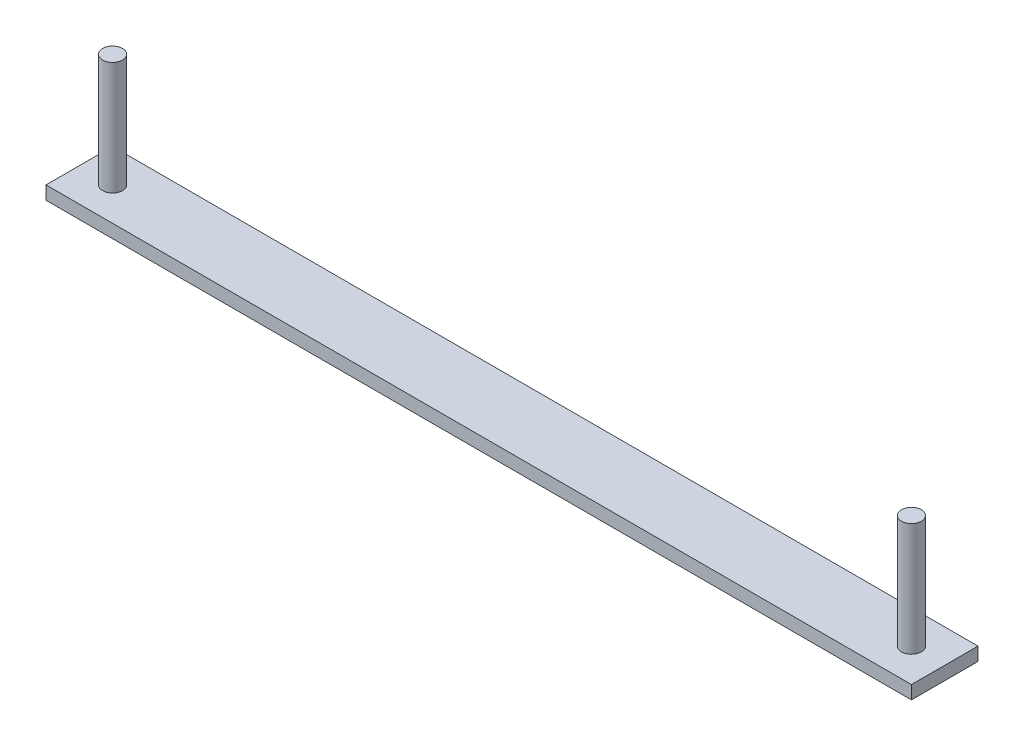
ISO-10303-21;
HEADER;
FILE_DESCRIPTION(('STEP AP214'),'2;1');
FILE_NAME('part.step','',(''),(''),'','','');
FILE_SCHEMA(('AUTOMOTIVE_DESIGN { 1 0 10303 214 1 1 1 1 }'));
ENDSEC;
DATA;
#1=APPLICATION_CONTEXT('core data for automotive mechanical design processes');
#2=APPLICATION_PROTOCOL_DEFINITION('international standard','automotive_design',2000,#1);
#3=PRODUCT_CONTEXT('',#1,'mechanical');
#4=PRODUCT('Part','Part','',(#3));
#5=PRODUCT_RELATED_PRODUCT_CATEGORY('part','',(#4));
#6=PRODUCT_DEFINITION_FORMATION('','',#4);
#7=PRODUCT_DEFINITION_CONTEXT('part definition',#1,'design');
#8=PRODUCT_DEFINITION('design','',#6,#7);
#9=PRODUCT_DEFINITION_SHAPE('','',#8);
#10=(LENGTH_UNIT() NAMED_UNIT(*) SI_UNIT(.MILLI.,.METRE.));
#11=(NAMED_UNIT(*) PLANE_ANGLE_UNIT() SI_UNIT($,.RADIAN.));
#12=(NAMED_UNIT(*) SI_UNIT($,.STERADIAN.) SOLID_ANGLE_UNIT());
#13=UNCERTAINTY_MEASURE_WITH_UNIT(LENGTH_MEASURE(1.E-05),#10,'distance_accuracy_value','');
#14=(GEOMETRIC_REPRESENTATION_CONTEXT(3) GLOBAL_UNCERTAINTY_ASSIGNED_CONTEXT((#13)) GLOBAL_UNIT_ASSIGNED_CONTEXT((#10,
#11,#12)) REPRESENTATION_CONTEXT('',''));
#15=CARTESIAN_POINT('',(0.,0.,0.));
#16=DIRECTION('',(0.,0.,1.));
#17=DIRECTION('',(1.,0.,0.));
#18=AXIS2_PLACEMENT_3D('',#15,#16,#17);
#19=CARTESIAN_POINT('',(65.,2.,5.));
#20=DIRECTION('',(-1.,0.,0.));
#21=DIRECTION('',(0.,0.,1.));
#22=AXIS2_PLACEMENT_3D('',#19,#20,#21);
#23=PLANE('',#22);
#24=DIRECTION('',(0.,0.,-1.));
#25=VECTOR('',#24,1.);
#26=CARTESIAN_POINT('',(65.,0.,5.));
#27=LINE('',#26,#25);
#28=CARTESIAN_POINT('',(65.,0.,5.));
#29=VERTEX_POINT('',#28);
#30=CARTESIAN_POINT('',(65.,0.,-5.));
#31=VERTEX_POINT('',#30);
#32=EDGE_CURVE('E116',#29,#31,#27,.T.);
#33=ORIENTED_EDGE('',*,*,#32,.T.);
#34=DIRECTION('',(0.,-1.,0.));
#35=VECTOR('',#34,1.);
#36=CARTESIAN_POINT('',(65.,2.,-5.));
#37=LINE('',#36,#35);
#38=CARTESIAN_POINT('',(65.,2.,-5.));
#39=VERTEX_POINT('',#38);
#40=EDGE_CURVE('E54',#39,#31,#37,.T.);
#41=ORIENTED_EDGE('',*,*,#40,.F.);
#42=DIRECTION('',(0.,0.,-1.));
#43=VECTOR('',#42,1.);
#44=CARTESIAN_POINT('',(65.,2.,5.));
#45=LINE('',#44,#43);
#46=CARTESIAN_POINT('',(65.,2.,5.));
#47=VERTEX_POINT('',#46);
#48=EDGE_CURVE('E98',#47,#39,#45,.T.);
#49=ORIENTED_EDGE('',*,*,#48,.F.);
#50=DIRECTION('',(0.,-1.,0.));
#51=VECTOR('',#50,1.);
#52=CARTESIAN_POINT('',(65.,2.,5.));
#53=LINE('',#52,#51);
#54=EDGE_CURVE('E112',#47,#29,#53,.T.);
#55=ORIENTED_EDGE('',*,*,#54,.T.);
#56=EDGE_LOOP('',(#33,#41,#49,#55));
#57=FACE_BOUND('',#56,.T.);
#58=ADVANCED_FACE('F45',(#57),#23,.F.);
#59=CARTESIAN_POINT('',(-65.,2.,-5.));
#60=DIRECTION('',(0.,0.,1.));
#61=DIRECTION('',(1.,0.,0.));
#62=AXIS2_PLACEMENT_3D('',#59,#60,#61);
#63=PLANE('',#62);
#64=DIRECTION('',(-1.,0.,0.));
#65=VECTOR('',#64,1.);
#66=CARTESIAN_POINT('',(-65.,0.,-5.));
#67=LINE('',#66,#65);
#68=CARTESIAN_POINT('',(-65.,0.,-5.));
#69=VERTEX_POINT('',#68);
#70=EDGE_CURVE('E104',#31,#69,#67,.T.);
#71=ORIENTED_EDGE('',*,*,#70,.T.);
#72=DIRECTION('',(0.,-1.,0.));
#73=VECTOR('',#72,1.);
#74=CARTESIAN_POINT('',(-65.,2.,-5.));
#75=LINE('',#74,#73);
#76=CARTESIAN_POINT('',(-65.,2.,-5.));
#77=VERTEX_POINT('',#76);
#78=EDGE_CURVE('E102',#77,#69,#75,.T.);
#79=ORIENTED_EDGE('',*,*,#78,.F.);
#80=DIRECTION('',(-1.,0.,0.));
#81=VECTOR('',#80,1.);
#82=CARTESIAN_POINT('',(-65.,2.,-5.));
#83=LINE('',#82,#81);
#84=EDGE_CURVE('E93',#39,#77,#83,.T.);
#85=ORIENTED_EDGE('',*,*,#84,.F.);
#86=ORIENTED_EDGE('',*,*,#40,.T.);
#87=EDGE_LOOP('',(#71,#79,#85,#86));
#88=FACE_BOUND('',#87,.T.);
#89=ADVANCED_FACE('F103',(#88),#63,.F.);
#90=CARTESIAN_POINT('',(-65.,2.,5.));
#91=DIRECTION('',(1.,0.,0.));
#92=DIRECTION('',(0.,0.,-1.));
#93=AXIS2_PLACEMENT_3D('',#90,#91,#92);
#94=PLANE('',#93);
#95=DIRECTION('',(0.,0.,1.));
#96=VECTOR('',#95,1.);
#97=CARTESIAN_POINT('',(-65.,0.,5.));
#98=LINE('',#97,#96);
#99=CARTESIAN_POINT('',(-65.,0.,5.));
#100=VERTEX_POINT('',#99);
#101=EDGE_CURVE('E79',#69,#100,#98,.T.);
#102=ORIENTED_EDGE('',*,*,#101,.T.);
#103=DIRECTION('',(0.,-1.,0.));
#104=VECTOR('',#103,1.);
#105=CARTESIAN_POINT('',(-65.,2.,5.));
#106=LINE('',#105,#104);
#107=CARTESIAN_POINT('',(-65.,2.,5.));
#108=VERTEX_POINT('',#107);
#109=EDGE_CURVE('E106',#108,#100,#106,.T.);
#110=ORIENTED_EDGE('',*,*,#109,.F.);
#111=DIRECTION('',(0.,0.,1.));
#112=VECTOR('',#111,1.);
#113=CARTESIAN_POINT('',(-65.,2.,5.));
#114=LINE('',#113,#112);
#115=EDGE_CURVE('E96',#77,#108,#114,.T.);
#116=ORIENTED_EDGE('',*,*,#115,.F.);
#117=ORIENTED_EDGE('',*,*,#78,.T.);
#118=EDGE_LOOP('',(#102,#110,#116,#117));
#119=FACE_BOUND('',#118,.T.);
#120=ADVANCED_FACE('F108',(#119),#94,.F.);
#121=CARTESIAN_POINT('',(-65.,2.,5.));
#122=DIRECTION('',(0.,0.,-1.));
#123=DIRECTION('',(-1.,0.,0.));
#124=AXIS2_PLACEMENT_3D('',#121,#122,#123);
#125=PLANE('',#124);
#126=DIRECTION('',(1.,0.,0.));
#127=VECTOR('',#126,1.);
#128=CARTESIAN_POINT('',(-65.,0.,5.));
#129=LINE('',#128,#127);
#130=EDGE_CURVE('E85',#100,#29,#129,.T.);
#131=ORIENTED_EDGE('',*,*,#130,.T.);
#132=ORIENTED_EDGE('',*,*,#54,.F.);
#133=DIRECTION('',(1.,0.,0.));
#134=VECTOR('',#133,1.);
#135=CARTESIAN_POINT('',(-65.,2.,5.));
#136=LINE('',#135,#134);
#137=EDGE_CURVE('E62',#108,#47,#136,.T.);
#138=ORIENTED_EDGE('',*,*,#137,.F.);
#139=ORIENTED_EDGE('',*,*,#109,.T.);
#140=EDGE_LOOP('',(#131,#132,#138,#139));
#141=FACE_BOUND('',#140,.T.);
#142=ADVANCED_FACE('F146',(#141),#125,.F.);
#143=CARTESIAN_POINT('',(0.,2.,0.));
#144=DIRECTION('',(0.,-1.,0.));
#145=DIRECTION('',(0.,0.,-1.));
#146=AXIS2_PLACEMENT_3D('',#143,#144,#145);
#147=PLANE('',#146);
#148=CARTESIAN_POINT('',(60.,2.,0.));
#149=DIRECTION('',(0.,-1.,0.));
#150=DIRECTION('',(0.,0.,1.));
#151=AXIS2_PLACEMENT_3D('',#148,#149,#150);
#152=CIRCLE('',#151,1.5);
#153=CARTESIAN_POINT('',(60.,2.,1.5));
#154=VERTEX_POINT('',#153);
#155=EDGE_CURVE('E227',#154,#154,#152,.T.);
#156=ORIENTED_EDGE('',*,*,#155,.T.);
#157=EDGE_LOOP('',(#156));
#158=FACE_BOUND('',#157,.T.);
#159=CARTESIAN_POINT('',(-60.,2.,0.));
#160=DIRECTION('',(0.,-1.,0.));
#161=DIRECTION('',(0.,0.,-1.));
#162=AXIS2_PLACEMENT_3D('',#159,#160,#161);
#163=CIRCLE('',#162,1.5);
#164=CARTESIAN_POINT('',(-60.,2.,-1.5));
#165=VERTEX_POINT('',#164);
#166=EDGE_CURVE('E11',#165,#165,#163,.F.);
#167=ORIENTED_EDGE('',*,*,#166,.F.);
#168=EDGE_LOOP('',(#167));
#169=FACE_BOUND('',#168,.T.);
#170=ORIENTED_EDGE('',*,*,#48,.T.);
#171=ORIENTED_EDGE('',*,*,#84,.T.);
#172=ORIENTED_EDGE('',*,*,#115,.T.);
#173=ORIENTED_EDGE('',*,*,#137,.T.);
#174=EDGE_LOOP('',(#170,#171,#172,#173));
#175=FACE_BOUND('',#174,.T.);
#176=ADVANCED_FACE('F94',(#158,#169,#175),#147,.F.);
#177=CARTESIAN_POINT('',(0.,0.,0.));
#178=DIRECTION('',(0.,-1.,0.));
#179=DIRECTION('',(0.,0.,-1.));
#180=AXIS2_PLACEMENT_3D('',#177,#178,#179);
#181=PLANE('',#180);
#182=ORIENTED_EDGE('',*,*,#32,.F.);
#183=ORIENTED_EDGE('',*,*,#130,.F.);
#184=ORIENTED_EDGE('',*,*,#101,.F.);
#185=ORIENTED_EDGE('',*,*,#70,.F.);
#186=EDGE_LOOP('',(#182,#183,#184,#185));
#187=FACE_BOUND('',#186,.T.);
#188=ADVANCED_FACE('F134',(#187),#181,.T.);
#189=CARTESIAN_POINT('',(-60.,19.,0.));
#190=DIRECTION('',(0.,-1.,0.));
#191=DIRECTION('',(0.,0.,-1.));
#192=AXIS2_PLACEMENT_3D('',#189,#190,#191);
#193=CYLINDRICAL_SURFACE('',#192,1.5);
#194=CARTESIAN_POINT('',(-60.,19.,0.));
#195=DIRECTION('',(0.,1.,0.));
#196=DIRECTION('',(0.,0.,1.));
#197=AXIS2_PLACEMENT_3D('',#194,#195,#196);
#198=CIRCLE('',#197,1.5);
#199=CARTESIAN_POINT('',(-60.,19.,1.5));
#200=VERTEX_POINT('',#199);
#201=EDGE_CURVE('E120',#200,#200,#198,.T.);
#202=ORIENTED_EDGE('',*,*,#201,.F.);
#203=EDGE_LOOP('',(#202));
#204=FACE_BOUND('',#203,.T.);
#205=ORIENTED_EDGE('',*,*,#166,.T.);
#206=EDGE_LOOP('',(#205));
#207=FACE_BOUND('',#206,.T.);
#208=ADVANCED_FACE('F136',(#204,#207),#193,.T.);
#209=CARTESIAN_POINT('',(-60.,19.,0.));
#210=DIRECTION('',(0.,1.,0.));
#211=DIRECTION('',(0.,0.,1.));
#212=AXIS2_PLACEMENT_3D('',#209,#210,#211);
#213=PLANE('',#212);
#214=ORIENTED_EDGE('',*,*,#201,.T.);
#215=EDGE_LOOP('',(#214));
#216=FACE_BOUND('',#215,.T.);
#217=ADVANCED_FACE('F142',(#216),#213,.T.);
#218=CARTESIAN_POINT('',(60.,19.,0.));
#219=DIRECTION('',(0.,-1.,0.));
#220=DIRECTION('',(0.,0.,-1.));
#221=AXIS2_PLACEMENT_3D('',#218,#219,#220);
#222=CYLINDRICAL_SURFACE('',#221,1.5);
#223=CARTESIAN_POINT('',(60.,19.,0.));
#224=DIRECTION('',(0.,-1.,0.));
#225=DIRECTION('',(0.,0.,1.));
#226=AXIS2_PLACEMENT_3D('',#223,#224,#225);
#227=CIRCLE('',#226,1.5);
#228=CARTESIAN_POINT('',(60.,19.,1.5));
#229=VERTEX_POINT('',#228);
#230=EDGE_CURVE('E225',#229,#229,#227,.T.);
#231=ORIENTED_EDGE('',*,*,#230,.T.);
#232=EDGE_LOOP('',(#231));
#233=FACE_BOUND('',#232,.T.);
#234=ORIENTED_EDGE('',*,*,#155,.F.);
#235=EDGE_LOOP('',(#234));
#236=FACE_BOUND('',#235,.T.);
#237=ADVANCED_FACE('F197',(#233,#236),#222,.T.);
#238=CARTESIAN_POINT('',(60.,19.,0.));
#239=DIRECTION('',(0.,1.,0.));
#240=DIRECTION('',(0.,0.,1.));
#241=AXIS2_PLACEMENT_3D('',#238,#239,#240);
#242=PLANE('',#241);
#243=ORIENTED_EDGE('',*,*,#230,.F.);
#244=EDGE_LOOP('',(#243));
#245=FACE_BOUND('',#244,.T.);
#246=ADVANCED_FACE('F206',(#245),#242,.T.);
#247=CLOSED_SHELL('',(#58,#89,#120,#142,#176,#188,#208,#217,#237,#246));
#248=MANIFOLD_SOLID_BREP('B2',#247);
#249=ADVANCED_BREP_SHAPE_REPRESENTATION('',(#18,#248),#14);
#250=SHAPE_DEFINITION_REPRESENTATION(#9,#249);
ENDSEC;
END-ISO-10303-21;
